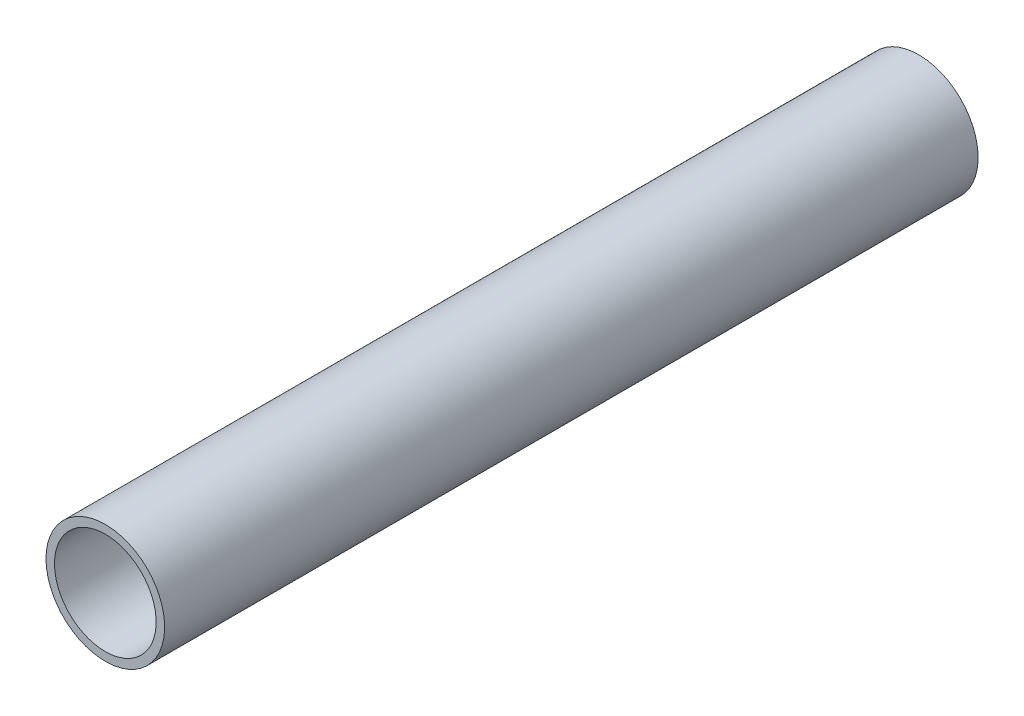
ISO-10303-21;
HEADER;
FILE_DESCRIPTION(('STEP AP214'),'2;1');
FILE_NAME('part.step','',(''),(''),'','','');
FILE_SCHEMA(('AUTOMOTIVE_DESIGN { 1 0 10303 214 1 1 1 1 }'));
ENDSEC;
DATA;
#1=APPLICATION_CONTEXT('core data for automotive mechanical design processes');
#2=APPLICATION_PROTOCOL_DEFINITION('international standard','automotive_design',2000,#1);
#3=PRODUCT_CONTEXT('',#1,'mechanical');
#4=PRODUCT('Part','Part','',(#3));
#5=PRODUCT_RELATED_PRODUCT_CATEGORY('part','',(#4));
#6=PRODUCT_DEFINITION_FORMATION('','',#4);
#7=PRODUCT_DEFINITION_CONTEXT('part definition',#1,'design');
#8=PRODUCT_DEFINITION('design','',#6,#7);
#9=PRODUCT_DEFINITION_SHAPE('','',#8);
#10=(LENGTH_UNIT() NAMED_UNIT(*) SI_UNIT(.MILLI.,.METRE.));
#11=(NAMED_UNIT(*) PLANE_ANGLE_UNIT() SI_UNIT($,.RADIAN.));
#12=(NAMED_UNIT(*) SI_UNIT($,.STERADIAN.) SOLID_ANGLE_UNIT());
#13=UNCERTAINTY_MEASURE_WITH_UNIT(LENGTH_MEASURE(1.E-05),#10,'distance_accuracy_value','');
#14=(GEOMETRIC_REPRESENTATION_CONTEXT(3) GLOBAL_UNCERTAINTY_ASSIGNED_CONTEXT((#13)) GLOBAL_UNIT_ASSIGNED_CONTEXT((#10,
#11,#12)) REPRESENTATION_CONTEXT('',''));
#15=CARTESIAN_POINT('',(0.,0.,0.));
#16=DIRECTION('',(0.,0.,1.));
#17=DIRECTION('',(1.,0.,0.));
#18=AXIS2_PLACEMENT_3D('',#15,#16,#17);
#19=CARTESIAN_POINT('',(0.,0.,76.2));
#20=DIRECTION('',(0.,0.,1.));
#21=DIRECTION('',(1.,0.,0.));
#22=AXIS2_PLACEMENT_3D('',#19,#20,#21);
#23=PLANE('',#22);
#24=CARTESIAN_POINT('',(0.,0.,76.2));
#25=DIRECTION('',(0.,0.,1.));
#26=DIRECTION('',(1.,0.,0.));
#27=AXIS2_PLACEMENT_3D('',#24,#25,#26);
#28=CIRCLE('',#27,11.1125);
#29=CARTESIAN_POINT('',(-11.1125,0.,76.2));
#30=VERTEX_POINT('',#29);
#31=EDGE_CURVE('E10',#30,#30,#28,.T.);
#32=ORIENTED_EDGE('',*,*,#31,.T.);
#33=EDGE_LOOP('',(#32));
#34=FACE_BOUND('',#33,.T.);
#35=CARTESIAN_POINT('',(0.,0.,76.2));
#36=DIRECTION('',(0.,0.,1.));
#37=DIRECTION('',(1.,0.,0.));
#38=AXIS2_PLACEMENT_3D('',#35,#36,#37);
#39=CIRCLE('',#38,9.525);
#40=CARTESIAN_POINT('',(-9.525,0.,76.2));
#41=VERTEX_POINT('',#40);
#42=EDGE_CURVE('E43',#41,#41,#39,.T.);
#43=ORIENTED_EDGE('',*,*,#42,.F.);
#44=EDGE_LOOP('',(#43));
#45=FACE_BOUND('',#44,.T.);
#46=ADVANCED_FACE('F32',(#34,#45),#23,.T.);
#47=CARTESIAN_POINT('',(0.,0.,-76.2));
#48=DIRECTION('',(0.,0.,1.));
#49=DIRECTION('',(1.,0.,0.));
#50=AXIS2_PLACEMENT_3D('',#47,#48,#49);
#51=PLANE('',#50);
#52=CARTESIAN_POINT('',(0.,0.,-76.2));
#53=DIRECTION('',(0.,0.,1.));
#54=DIRECTION('',(1.,0.,0.));
#55=AXIS2_PLACEMENT_3D('',#52,#53,#54);
#56=CIRCLE('',#55,11.1125);
#57=CARTESIAN_POINT('',(-11.1125,0.,-76.2));
#58=VERTEX_POINT('',#57);
#59=EDGE_CURVE('E36',#58,#58,#56,.T.);
#60=ORIENTED_EDGE('',*,*,#59,.F.);
#61=EDGE_LOOP('',(#60));
#62=FACE_BOUND('',#61,.T.);
#63=CARTESIAN_POINT('',(0.,0.,-76.2));
#64=DIRECTION('',(0.,0.,1.));
#65=DIRECTION('',(1.,0.,0.));
#66=AXIS2_PLACEMENT_3D('',#63,#64,#65);
#67=CIRCLE('',#66,9.525);
#68=CARTESIAN_POINT('',(-9.525,0.,-76.2));
#69=VERTEX_POINT('',#68);
#70=EDGE_CURVE('E45',#69,#69,#67,.T.);
#71=ORIENTED_EDGE('',*,*,#70,.T.);
#72=EDGE_LOOP('',(#71));
#73=FACE_BOUND('',#72,.T.);
#74=ADVANCED_FACE('F55',(#62,#73),#51,.F.);
#75=CARTESIAN_POINT('',(0.,0.,76.2));
#76=DIRECTION('',(0.,0.,-1.));
#77=DIRECTION('',(-1.,0.,0.));
#78=AXIS2_PLACEMENT_3D('',#75,#76,#77);
#79=CYLINDRICAL_SURFACE('',#78,11.1125);
#80=CARTESIAN_POINT('',(-11.1125,0.,76.2));
#81=CARTESIAN_POINT('',(-11.1125,0.,74.6125));
#82=CARTESIAN_POINT('',(-11.1125,0.,73.025));
#83=CARTESIAN_POINT('',(-11.1125,0.,69.85));
#84=CARTESIAN_POINT('',(-11.1125,0.,68.2625));
#85=CARTESIAN_POINT('',(-11.1125,0.,65.0875));
#86=CARTESIAN_POINT('',(-11.1125,0.,63.5));
#87=CARTESIAN_POINT('',(-11.1125,0.,60.325));
#88=CARTESIAN_POINT('',(-11.1125,0.,58.7375));
#89=CARTESIAN_POINT('',(-11.1125,0.,55.5625));
#90=CARTESIAN_POINT('',(-11.1125,0.,53.975));
#91=CARTESIAN_POINT('',(-11.1125,0.,50.8));
#92=CARTESIAN_POINT('',(-11.1125,0.,49.2125));
#93=CARTESIAN_POINT('',(-11.1125,0.,46.0375));
#94=CARTESIAN_POINT('',(-11.1125,0.,44.45));
#95=CARTESIAN_POINT('',(-11.1125,0.,41.275));
#96=CARTESIAN_POINT('',(-11.1125,0.,39.6875));
#97=CARTESIAN_POINT('',(-11.1125,0.,36.5125));
#98=CARTESIAN_POINT('',(-11.1125,0.,34.925));
#99=CARTESIAN_POINT('',(-11.1125,0.,31.75));
#100=CARTESIAN_POINT('',(-11.1125,0.,30.1625));
#101=CARTESIAN_POINT('',(-11.1125,0.,26.9875));
#102=CARTESIAN_POINT('',(-11.1125,0.,25.4));
#103=CARTESIAN_POINT('',(-11.1125,0.,22.225));
#104=CARTESIAN_POINT('',(-11.1125,0.,20.6375));
#105=CARTESIAN_POINT('',(-11.1125,0.,17.4625));
#106=CARTESIAN_POINT('',(-11.1125,0.,15.875));
#107=CARTESIAN_POINT('',(-11.1125,0.,12.7));
#108=CARTESIAN_POINT('',(-11.1125,0.,11.1125));
#109=CARTESIAN_POINT('',(-11.1125,0.,7.93750000000001));
#110=CARTESIAN_POINT('',(-11.1125,0.,6.35));
#111=CARTESIAN_POINT('',(-11.1125,0.,3.175));
#112=CARTESIAN_POINT('',(-11.1125,0.,1.5875));
#113=CARTESIAN_POINT('',(-11.1125,0.,-1.5875));
#114=CARTESIAN_POINT('',(-11.1125,0.,-3.175));
#115=CARTESIAN_POINT('',(-11.1125,0.,-6.35));
#116=CARTESIAN_POINT('',(-11.1125,0.,-7.93750000000001));
#117=CARTESIAN_POINT('',(-11.1125,0.,-11.1125));
#118=CARTESIAN_POINT('',(-11.1125,0.,-12.7));
#119=CARTESIAN_POINT('',(-11.1125,0.,-15.875));
#120=CARTESIAN_POINT('',(-11.1125,0.,-17.4625));
#121=CARTESIAN_POINT('',(-11.1125,0.,-20.6375));
#122=CARTESIAN_POINT('',(-11.1125,0.,-22.225));
#123=CARTESIAN_POINT('',(-11.1125,0.,-25.4));
#124=CARTESIAN_POINT('',(-11.1125,0.,-26.9875));
#125=CARTESIAN_POINT('',(-11.1125,0.,-30.1625));
#126=CARTESIAN_POINT('',(-11.1125,0.,-31.75));
#127=CARTESIAN_POINT('',(-11.1125,0.,-34.925));
#128=CARTESIAN_POINT('',(-11.1125,0.,-36.5125));
#129=CARTESIAN_POINT('',(-11.1125,0.,-39.6875));
#130=CARTESIAN_POINT('',(-11.1125,0.,-41.275));
#131=CARTESIAN_POINT('',(-11.1125,0.,-44.45));
#132=CARTESIAN_POINT('',(-11.1125,0.,-46.0375));
#133=CARTESIAN_POINT('',(-11.1125,0.,-49.2125));
#134=CARTESIAN_POINT('',(-11.1125,0.,-50.8));
#135=CARTESIAN_POINT('',(-11.1125,0.,-53.975));
#136=CARTESIAN_POINT('',(-11.1125,0.,-55.5625));
#137=CARTESIAN_POINT('',(-11.1125,0.,-58.7375));
#138=CARTESIAN_POINT('',(-11.1125,0.,-60.325));
#139=CARTESIAN_POINT('',(-11.1125,0.,-63.5));
#140=CARTESIAN_POINT('',(-11.1125,0.,-65.0875));
#141=CARTESIAN_POINT('',(-11.1125,0.,-68.2625));
#142=CARTESIAN_POINT('',(-11.1125,0.,-69.85));
#143=CARTESIAN_POINT('',(-11.1125,0.,-73.025));
#144=CARTESIAN_POINT('',(-11.1125,0.,-74.6125));
#145=CARTESIAN_POINT('',(-11.1125,0.,-76.2));
#146=B_SPLINE_CURVE_WITH_KNOTS('',3,(#80,#81,#82,#83,#84,#85,#86,#87,#88,#89,#90,#91,#92,#93,
#94,#95,#96,#97,#98,#99,#100,#101,#102,#103,#104,#105,#106,#107,#108,#109,#110,#111,#112,#113,
#114,#115,#116,#117,#118,#119,#120,#121,#122,#123,#124,#125,#126,#127,#128,#129,#130,#131,#132,
#133,#134,#135,#136,#137,#138,#139,#140,#141,#142,#143,#144,#145),.UNSPECIFIED.,.F.,.F.,(4,2,2,
2,2,2,2,2,2,2,2,2,2,2,2,2,2,2,2,2,2,2,2,2,2,2,2,2,2,2,2,2,4),(0.,4.7625,9.52500000000001,
14.2875,19.05,23.8125,28.575,33.3375,38.1,42.8625,47.625,52.3875,57.15,61.9125,66.675,71.4375,
76.2,80.9625,85.725,90.4875,95.25,100.0125,104.775,109.5375,114.3,119.0625,123.825,128.5875,
133.35,138.1125,142.875,147.6375,152.4),.UNSPECIFIED.);
#147=EDGE_CURVE('BSEAM34',#30,#58,#146,.T.);
#148=ORIENTED_EDGE('',*,*,#31,.F.);
#149=ORIENTED_EDGE('',*,*,#59,.T.);
#150=ORIENTED_EDGE('',*,*,#147,.T.);
#151=ORIENTED_EDGE('',*,*,#147,.F.);
#152=EDGE_LOOP('',(#148,#150,#149,#151));
#153=FACE_BOUND('',#152,.T.);
#154=ADVANCED_FACE('F34',(#153),#79,.T.);
#155=CARTESIAN_POINT('',(0.,0.,76.2));
#156=DIRECTION('',(0.,0.,-1.));
#157=DIRECTION('',(-1.,0.,0.));
#158=AXIS2_PLACEMENT_3D('',#155,#156,#157);
#159=CYLINDRICAL_SURFACE('',#158,9.525);
#160=CARTESIAN_POINT('',(-9.525,0.,76.2));
#161=CARTESIAN_POINT('',(-9.525,0.,74.6125));
#162=CARTESIAN_POINT('',(-9.525,0.,73.025));
#163=CARTESIAN_POINT('',(-9.525,0.,69.85));
#164=CARTESIAN_POINT('',(-9.525,0.,68.2625));
#165=CARTESIAN_POINT('',(-9.525,0.,65.0875));
#166=CARTESIAN_POINT('',(-9.525,0.,63.5));
#167=CARTESIAN_POINT('',(-9.525,0.,60.325));
#168=CARTESIAN_POINT('',(-9.525,0.,58.7375));
#169=CARTESIAN_POINT('',(-9.525,0.,55.5625));
#170=CARTESIAN_POINT('',(-9.525,0.,53.975));
#171=CARTESIAN_POINT('',(-9.525,0.,50.8));
#172=CARTESIAN_POINT('',(-9.525,0.,49.2125));
#173=CARTESIAN_POINT('',(-9.525,0.,46.0375));
#174=CARTESIAN_POINT('',(-9.525,0.,44.45));
#175=CARTESIAN_POINT('',(-9.525,0.,41.275));
#176=CARTESIAN_POINT('',(-9.525,0.,39.6875));
#177=CARTESIAN_POINT('',(-9.525,0.,36.5125));
#178=CARTESIAN_POINT('',(-9.525,0.,34.925));
#179=CARTESIAN_POINT('',(-9.525,0.,31.75));
#180=CARTESIAN_POINT('',(-9.525,0.,30.1625));
#181=CARTESIAN_POINT('',(-9.525,0.,26.9875));
#182=CARTESIAN_POINT('',(-9.525,0.,25.4));
#183=CARTESIAN_POINT('',(-9.525,0.,22.225));
#184=CARTESIAN_POINT('',(-9.525,0.,20.6375));
#185=CARTESIAN_POINT('',(-9.525,0.,17.4625));
#186=CARTESIAN_POINT('',(-9.525,0.,15.875));
#187=CARTESIAN_POINT('',(-9.525,0.,12.7));
#188=CARTESIAN_POINT('',(-9.525,0.,11.1125));
#189=CARTESIAN_POINT('',(-9.525,0.,7.93750000000001));
#190=CARTESIAN_POINT('',(-9.525,0.,6.35));
#191=CARTESIAN_POINT('',(-9.525,0.,3.175));
#192=CARTESIAN_POINT('',(-9.525,0.,1.5875));
#193=CARTESIAN_POINT('',(-9.525,0.,-1.5875));
#194=CARTESIAN_POINT('',(-9.525,0.,-3.175));
#195=CARTESIAN_POINT('',(-9.525,0.,-6.35));
#196=CARTESIAN_POINT('',(-9.525,0.,-7.93750000000001));
#197=CARTESIAN_POINT('',(-9.525,0.,-11.1125));
#198=CARTESIAN_POINT('',(-9.525,0.,-12.7));
#199=CARTESIAN_POINT('',(-9.525,0.,-15.875));
#200=CARTESIAN_POINT('',(-9.525,0.,-17.4625));
#201=CARTESIAN_POINT('',(-9.525,0.,-20.6375));
#202=CARTESIAN_POINT('',(-9.525,0.,-22.225));
#203=CARTESIAN_POINT('',(-9.525,0.,-25.4));
#204=CARTESIAN_POINT('',(-9.525,0.,-26.9875));
#205=CARTESIAN_POINT('',(-9.525,0.,-30.1625));
#206=CARTESIAN_POINT('',(-9.525,0.,-31.75));
#207=CARTESIAN_POINT('',(-9.525,0.,-34.925));
#208=CARTESIAN_POINT('',(-9.525,0.,-36.5125));
#209=CARTESIAN_POINT('',(-9.525,0.,-39.6875));
#210=CARTESIAN_POINT('',(-9.525,0.,-41.275));
#211=CARTESIAN_POINT('',(-9.525,0.,-44.45));
#212=CARTESIAN_POINT('',(-9.525,0.,-46.0375));
#213=CARTESIAN_POINT('',(-9.525,0.,-49.2125));
#214=CARTESIAN_POINT('',(-9.525,0.,-50.8));
#215=CARTESIAN_POINT('',(-9.525,0.,-53.975));
#216=CARTESIAN_POINT('',(-9.525,0.,-55.5625));
#217=CARTESIAN_POINT('',(-9.525,0.,-58.7375));
#218=CARTESIAN_POINT('',(-9.525,0.,-60.325));
#219=CARTESIAN_POINT('',(-9.525,0.,-63.5));
#220=CARTESIAN_POINT('',(-9.525,0.,-65.0875));
#221=CARTESIAN_POINT('',(-9.525,0.,-68.2625));
#222=CARTESIAN_POINT('',(-9.525,0.,-69.85));
#223=CARTESIAN_POINT('',(-9.525,0.,-73.025));
#224=CARTESIAN_POINT('',(-9.525,0.,-74.6125));
#225=CARTESIAN_POINT('',(-9.525,0.,-76.2));
#226=B_SPLINE_CURVE_WITH_KNOTS('',3,(#160,#161,#162,#163,#164,#165,#166,#167,#168,#169,#170,
#171,#172,#173,#174,#175,#176,#177,#178,#179,#180,#181,#182,#183,#184,#185,#186,#187,#188,#189,
#190,#191,#192,#193,#194,#195,#196,#197,#198,#199,#200,#201,#202,#203,#204,#205,#206,#207,#208,
#209,#210,#211,#212,#213,#214,#215,#216,#217,#218,#219,#220,#221,#222,#223,#224,#225),
.UNSPECIFIED.,.F.,.F.,(4,2,2,2,2,2,2,2,2,2,2,2,2,2,2,2,2,2,2,2,2,2,2,2,2,2,2,2,2,2,2,2,4),(0.,
4.7625,9.52500000000001,14.2875,19.05,23.8125,28.575,33.3375,38.1,42.8625,47.625,52.3875,57.15,
61.9125,66.675,71.4375,76.2,80.9625,85.725,90.4875,95.25,100.0125,104.775,109.5375,114.3,
119.0625,123.825,128.5875,133.35,138.1125,142.875,147.6375,152.4),.UNSPECIFIED.);
#227=EDGE_CURVE('BSEAM51',#41,#69,#226,.T.);
#228=ORIENTED_EDGE('',*,*,#42,.T.);
#229=ORIENTED_EDGE('',*,*,#70,.F.);
#230=ORIENTED_EDGE('',*,*,#227,.T.);
#231=ORIENTED_EDGE('',*,*,#227,.F.);
#232=EDGE_LOOP('',(#228,#230,#229,#231));
#233=FACE_BOUND('',#232,.T.);
#234=ADVANCED_FACE('F51',(#233),#159,.F.);
#235=CLOSED_SHELL('',(#46,#74,#154,#234));
#236=MANIFOLD_SOLID_BREP('B2',#235);
#237=ADVANCED_BREP_SHAPE_REPRESENTATION('',(#18,#236),#14);
#238=SHAPE_DEFINITION_REPRESENTATION(#9,#237);
ENDSEC;
END-ISO-10303-21;
